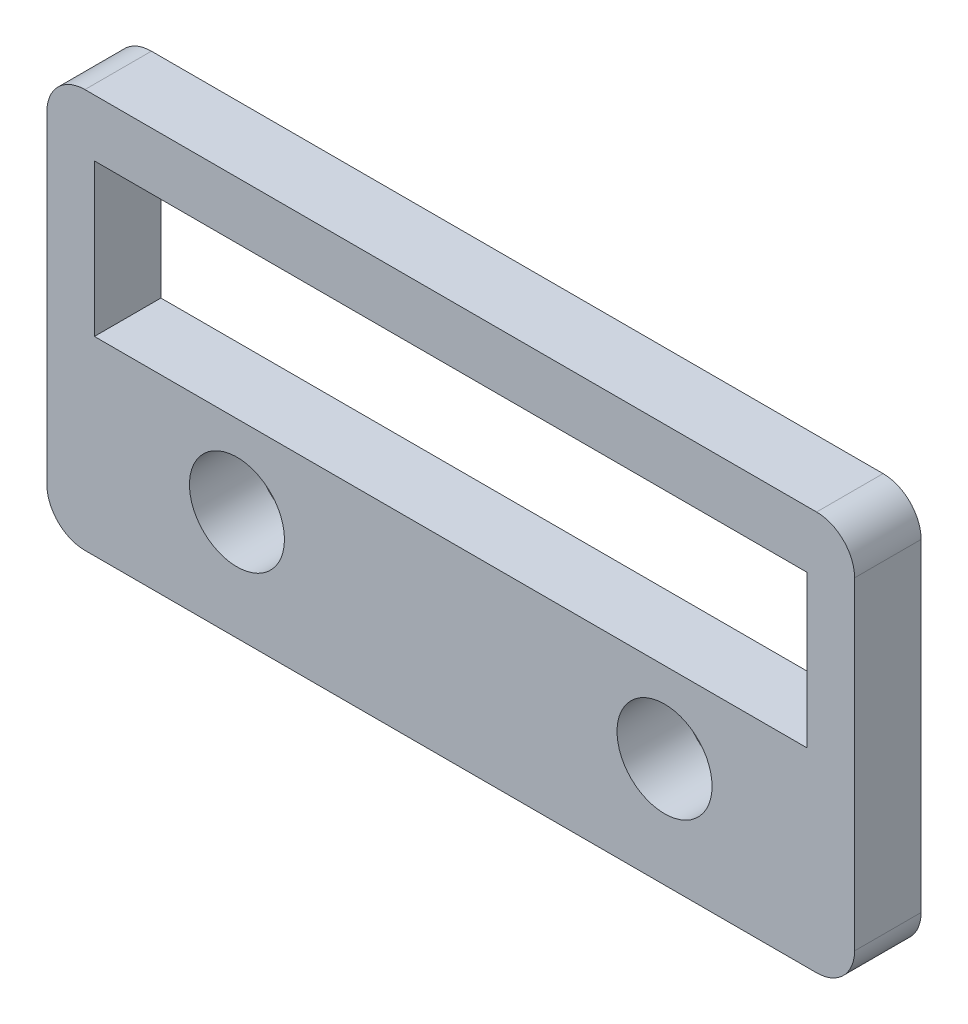
ISO-10303-21;
HEADER;
FILE_DESCRIPTION(('STEP AP214'),'2;1');
FILE_NAME('part.step','',(''),(''),'','','');
FILE_SCHEMA(('AUTOMOTIVE_DESIGN { 1 0 10303 214 1 1 1 1 }'));
ENDSEC;
DATA;
#1=APPLICATION_CONTEXT('core data for automotive mechanical design processes');
#2=APPLICATION_PROTOCOL_DEFINITION('international standard','automotive_design',2000,#1);
#3=PRODUCT_CONTEXT('',#1,'mechanical');
#4=PRODUCT('Part','Part','',(#3));
#5=PRODUCT_RELATED_PRODUCT_CATEGORY('part','',(#4));
#6=PRODUCT_DEFINITION_FORMATION('','',#4);
#7=PRODUCT_DEFINITION_CONTEXT('part definition',#1,'design');
#8=PRODUCT_DEFINITION('design','',#6,#7);
#9=PRODUCT_DEFINITION_SHAPE('','',#8);
#10=(LENGTH_UNIT() NAMED_UNIT(*) SI_UNIT(.MILLI.,.METRE.));
#11=(NAMED_UNIT(*) PLANE_ANGLE_UNIT() SI_UNIT($,.RADIAN.));
#12=(NAMED_UNIT(*) SI_UNIT($,.STERADIAN.) SOLID_ANGLE_UNIT());
#13=UNCERTAINTY_MEASURE_WITH_UNIT(LENGTH_MEASURE(1.E-05),#10,'distance_accuracy_value','');
#14=(GEOMETRIC_REPRESENTATION_CONTEXT(3) GLOBAL_UNCERTAINTY_ASSIGNED_CONTEXT((#13)) GLOBAL_UNIT_ASSIGNED_CONTEXT((#10,
#11,#12)) REPRESENTATION_CONTEXT('',''));
#15=CARTESIAN_POINT('',(0.,0.,0.));
#16=DIRECTION('',(0.,0.,1.));
#17=DIRECTION('',(1.,0.,0.));
#18=AXIS2_PLACEMENT_3D('',#15,#16,#17);
#19=CARTESIAN_POINT('',(47.6959064327485,23.5877192982456,7.));
#20=DIRECTION('',(0.,0.,-1.));
#21=DIRECTION('',(-1.,0.,0.));
#22=AXIS2_PLACEMENT_3D('',#19,#20,#21);
#23=CYLINDRICAL_SURFACE('',#22,4.);
#24=CARTESIAN_POINT('',(47.6959064327485,23.5877192982456,0.));
#25=DIRECTION('',(0.,0.,1.));
#26=DIRECTION('',(-1.,0.,0.));
#27=AXIS2_PLACEMENT_3D('',#24,#25,#26);
#28=CIRCLE('',#27,4.);
#29=CARTESIAN_POINT('',(51.6959064327485,23.5877192982456,0.));
#30=VERTEX_POINT('',#29);
#31=CARTESIAN_POINT('',(47.6959064327485,27.5877192982456,0.));
#32=VERTEX_POINT('',#31);
#33=EDGE_CURVE('E175',#30,#32,#28,.T.);
#34=ORIENTED_EDGE('',*,*,#33,.T.);
#35=DIRECTION('',(0.,0.,-1.));
#36=VECTOR('',#35,1.);
#37=CARTESIAN_POINT('',(47.6959064327485,27.5877192982456,7.));
#38=LINE('',#37,#36);
#39=CARTESIAN_POINT('',(47.6959064327485,27.5877192982456,7.));
#40=VERTEX_POINT('',#39);
#41=EDGE_CURVE('E11',#40,#32,#38,.T.);
#42=ORIENTED_EDGE('',*,*,#41,.F.);
#43=CARTESIAN_POINT('',(47.6959064327485,23.5877192982456,7.));
#44=DIRECTION('',(0.,0.,1.));
#45=DIRECTION('',(-1.,0.,0.));
#46=AXIS2_PLACEMENT_3D('',#43,#44,#45);
#47=CIRCLE('',#46,4.);
#48=CARTESIAN_POINT('',(51.6959064327485,23.5877192982456,7.));
#49=VERTEX_POINT('',#48);
#50=EDGE_CURVE('E181',#49,#40,#47,.T.);
#51=ORIENTED_EDGE('',*,*,#50,.F.);
#52=DIRECTION('',(0.,0.,-1.));
#53=VECTOR('',#52,1.);
#54=CARTESIAN_POINT('',(51.6959064327485,23.5877192982456,7.));
#55=LINE('',#54,#53);
#56=EDGE_CURVE('E207',#49,#30,#55,.T.);
#57=ORIENTED_EDGE('',*,*,#56,.T.);
#58=EDGE_LOOP('',(#34,#42,#51,#57));
#59=FACE_BOUND('',#58,.T.);
#60=ADVANCED_FACE('F39',(#59),#23,.T.);
#61=CARTESIAN_POINT('',(-29.3040935672514,27.5877192982456,7.));
#62=DIRECTION('',(0.,-1.,0.));
#63=DIRECTION('',(0.,0.,-1.));
#64=AXIS2_PLACEMENT_3D('',#61,#62,#63);
#65=PLANE('',#64);
#66=DIRECTION('',(-1.,0.,0.));
#67=VECTOR('',#66,1.);
#68=CARTESIAN_POINT('',(-29.3040935672514,27.5877192982456,0.));
#69=LINE('',#68,#67);
#70=CARTESIAN_POINT('',(-29.3040935672514,27.5877192982456,0.));
#71=VERTEX_POINT('',#70);
#72=EDGE_CURVE('E211',#32,#71,#69,.T.);
#73=ORIENTED_EDGE('',*,*,#72,.T.);
#74=DIRECTION('',(0.,0.,-1.));
#75=VECTOR('',#74,1.);
#76=CARTESIAN_POINT('',(-29.3040935672514,27.5877192982456,7.));
#77=LINE('',#76,#75);
#78=CARTESIAN_POINT('',(-29.3040935672514,27.5877192982456,7.));
#79=VERTEX_POINT('',#78);
#80=EDGE_CURVE('E47',#79,#71,#77,.T.);
#81=ORIENTED_EDGE('',*,*,#80,.F.);
#82=DIRECTION('',(-1.,0.,0.));
#83=VECTOR('',#82,1.);
#84=CARTESIAN_POINT('',(-29.3040935672514,27.5877192982456,7.));
#85=LINE('',#84,#83);
#86=EDGE_CURVE('E185',#40,#79,#85,.T.);
#87=ORIENTED_EDGE('',*,*,#86,.F.);
#88=ORIENTED_EDGE('',*,*,#41,.T.);
#89=EDGE_LOOP('',(#73,#81,#87,#88));
#90=FACE_BOUND('',#89,.T.);
#91=ADVANCED_FACE('F280',(#90),#65,.F.);
#92=CARTESIAN_POINT('',(-29.3040935672515,23.5877192982456,7.));
#93=DIRECTION('',(0.,0.,-1.));
#94=DIRECTION('',(-1.,0.,0.));
#95=AXIS2_PLACEMENT_3D('',#92,#93,#94);
#96=CYLINDRICAL_SURFACE('',#95,4.);
#97=CARTESIAN_POINT('',(-29.3040935672515,23.5877192982456,0.));
#98=DIRECTION('',(0.,0.,1.));
#99=DIRECTION('',(-1.,0.,0.));
#100=AXIS2_PLACEMENT_3D('',#97,#98,#99);
#101=CIRCLE('',#100,4.);
#102=CARTESIAN_POINT('',(-33.3040935672515,23.5877192982456,0.));
#103=VERTEX_POINT('',#102);
#104=EDGE_CURVE('E214',#71,#103,#101,.T.);
#105=ORIENTED_EDGE('',*,*,#104,.T.);
#106=DIRECTION('',(0.,0.,-1.));
#107=VECTOR('',#106,1.);
#108=CARTESIAN_POINT('',(-33.3040935672515,23.5877192982456,7.));
#109=LINE('',#108,#107);
#110=CARTESIAN_POINT('',(-33.3040935672515,23.5877192982456,7.));
#111=VERTEX_POINT('',#110);
#112=EDGE_CURVE('E250',#111,#103,#109,.T.);
#113=ORIENTED_EDGE('',*,*,#112,.F.);
#114=CARTESIAN_POINT('',(-29.3040935672515,23.5877192982456,7.));
#115=DIRECTION('',(0.,0.,1.));
#116=DIRECTION('',(-1.,0.,0.));
#117=AXIS2_PLACEMENT_3D('',#114,#115,#116);
#118=CIRCLE('',#117,4.);
#119=EDGE_CURVE('E189',#79,#111,#118,.T.);
#120=ORIENTED_EDGE('',*,*,#119,.F.);
#121=ORIENTED_EDGE('',*,*,#80,.T.);
#122=EDGE_LOOP('',(#105,#113,#120,#121));
#123=FACE_BOUND('',#122,.T.);
#124=ADVANCED_FACE('F259',(#123),#96,.T.);
#125=CARTESIAN_POINT('',(-33.3040935672515,23.5877192982456,7.));
#126=DIRECTION('',(1.,0.,0.));
#127=DIRECTION('',(0.,1.,0.));
#128=AXIS2_PLACEMENT_3D('',#125,#126,#127);
#129=PLANE('',#128);
#130=DIRECTION('',(0.,-1.,0.));
#131=VECTOR('',#130,1.);
#132=CARTESIAN_POINT('',(-33.3040935672515,23.5877192982456,0.));
#133=LINE('',#132,#131);
#134=CARTESIAN_POINT('',(-33.3040935672515,-10.4122807017544,0.));
#135=VERTEX_POINT('',#134);
#136=EDGE_CURVE('E217',#103,#135,#133,.T.);
#137=ORIENTED_EDGE('',*,*,#136,.T.);
#138=DIRECTION('',(0.,0.,-1.));
#139=VECTOR('',#138,1.);
#140=CARTESIAN_POINT('',(-33.3040935672515,-10.4122807017544,7.));
#141=LINE('',#140,#139);
#142=CARTESIAN_POINT('',(-33.3040935672515,-10.4122807017544,7.));
#143=VERTEX_POINT('',#142);
#144=EDGE_CURVE('E246',#143,#135,#141,.T.);
#145=ORIENTED_EDGE('',*,*,#144,.F.);
#146=DIRECTION('',(0.,-1.,0.));
#147=VECTOR('',#146,1.);
#148=CARTESIAN_POINT('',(-33.3040935672515,23.5877192982456,7.));
#149=LINE('',#148,#147);
#150=EDGE_CURVE('E192',#111,#143,#149,.T.);
#151=ORIENTED_EDGE('',*,*,#150,.F.);
#152=ORIENTED_EDGE('',*,*,#112,.T.);
#153=EDGE_LOOP('',(#137,#145,#151,#152));
#154=FACE_BOUND('',#153,.T.);
#155=ADVANCED_FACE('F268',(#154),#129,.F.);
#156=CARTESIAN_POINT('',(-29.3040935672515,-10.4122807017544,7.));
#157=DIRECTION('',(0.,0.,-1.));
#158=DIRECTION('',(-1.,0.,0.));
#159=AXIS2_PLACEMENT_3D('',#156,#157,#158);
#160=CYLINDRICAL_SURFACE('',#159,4.);
#161=CARTESIAN_POINT('',(-29.3040935672515,-10.4122807017544,0.));
#162=DIRECTION('',(0.,0.,1.));
#163=DIRECTION('',(1.,0.,0.));
#164=AXIS2_PLACEMENT_3D('',#161,#162,#163);
#165=CIRCLE('',#164,4.);
#166=CARTESIAN_POINT('',(-29.3040935672514,-14.4122807017544,0.));
#167=VERTEX_POINT('',#166);
#168=EDGE_CURVE('E220',#135,#167,#165,.T.);
#169=ORIENTED_EDGE('',*,*,#168,.T.);
#170=DIRECTION('',(0.,0.,-1.));
#171=VECTOR('',#170,1.);
#172=CARTESIAN_POINT('',(-29.3040935672514,-14.4122807017544,7.));
#173=LINE('',#172,#171);
#174=CARTESIAN_POINT('',(-29.3040935672514,-14.4122807017544,7.));
#175=VERTEX_POINT('',#174);
#176=EDGE_CURVE('E242',#175,#167,#173,.T.);
#177=ORIENTED_EDGE('',*,*,#176,.F.);
#178=CARTESIAN_POINT('',(-29.3040935672515,-10.4122807017544,7.));
#179=DIRECTION('',(0.,0.,1.));
#180=DIRECTION('',(1.,0.,0.));
#181=AXIS2_PLACEMENT_3D('',#178,#179,#180);
#182=CIRCLE('',#181,4.);
#183=EDGE_CURVE('E195',#143,#175,#182,.T.);
#184=ORIENTED_EDGE('',*,*,#183,.F.);
#185=ORIENTED_EDGE('',*,*,#144,.T.);
#186=EDGE_LOOP('',(#169,#177,#184,#185));
#187=FACE_BOUND('',#186,.T.);
#188=ADVANCED_FACE('F272',(#187),#160,.T.);
#189=CARTESIAN_POINT('',(-29.3040935672514,-14.4122807017544,7.));
#190=DIRECTION('',(0.,1.,0.));
#191=DIRECTION('',(0.,0.,1.));
#192=AXIS2_PLACEMENT_3D('',#189,#190,#191);
#193=PLANE('',#192);
#194=DIRECTION('',(1.,0.,0.));
#195=VECTOR('',#194,1.);
#196=CARTESIAN_POINT('',(-29.3040935672514,-14.4122807017544,0.));
#197=LINE('',#196,#195);
#198=CARTESIAN_POINT('',(47.6959064327485,-14.4122807017544,0.));
#199=VERTEX_POINT('',#198);
#200=EDGE_CURVE('E223',#167,#199,#197,.T.);
#201=ORIENTED_EDGE('',*,*,#200,.T.);
#202=DIRECTION('',(0.,0.,-1.));
#203=VECTOR('',#202,1.);
#204=CARTESIAN_POINT('',(47.6959064327485,-14.4122807017544,7.));
#205=LINE('',#204,#203);
#206=CARTESIAN_POINT('',(47.6959064327485,-14.4122807017544,7.));
#207=VERTEX_POINT('',#206);
#208=EDGE_CURVE('E238',#207,#199,#205,.T.);
#209=ORIENTED_EDGE('',*,*,#208,.F.);
#210=DIRECTION('',(1.,0.,0.));
#211=VECTOR('',#210,1.);
#212=CARTESIAN_POINT('',(-29.3040935672514,-14.4122807017544,7.));
#213=LINE('',#212,#211);
#214=EDGE_CURVE('E198',#175,#207,#213,.T.);
#215=ORIENTED_EDGE('',*,*,#214,.F.);
#216=ORIENTED_EDGE('',*,*,#176,.T.);
#217=EDGE_LOOP('',(#201,#209,#215,#216));
#218=FACE_BOUND('',#217,.T.);
#219=ADVANCED_FACE('F293',(#218),#193,.F.);
#220=CARTESIAN_POINT('',(47.6959064327485,-10.4122807017544,7.));
#221=DIRECTION('',(0.,0.,-1.));
#222=DIRECTION('',(-1.,0.,0.));
#223=AXIS2_PLACEMENT_3D('',#220,#221,#222);
#224=CYLINDRICAL_SURFACE('',#223,4.);
#225=CARTESIAN_POINT('',(47.6959064327485,-10.4122807017544,0.));
#226=DIRECTION('',(0.,0.,1.));
#227=DIRECTION('',(-1.,0.,0.));
#228=AXIS2_PLACEMENT_3D('',#225,#226,#227);
#229=CIRCLE('',#228,4.);
#230=CARTESIAN_POINT('',(51.6959064327485,-10.4122807017544,0.));
#231=VERTEX_POINT('',#230);
#232=EDGE_CURVE('E226',#199,#231,#229,.T.);
#233=ORIENTED_EDGE('',*,*,#232,.T.);
#234=DIRECTION('',(0.,0.,-1.));
#235=VECTOR('',#234,1.);
#236=CARTESIAN_POINT('',(51.6959064327485,-10.4122807017544,7.));
#237=LINE('',#236,#235);
#238=CARTESIAN_POINT('',(51.6959064327485,-10.4122807017544,7.));
#239=VERTEX_POINT('',#238);
#240=EDGE_CURVE('E234',#239,#231,#237,.T.);
#241=ORIENTED_EDGE('',*,*,#240,.F.);
#242=CARTESIAN_POINT('',(47.6959064327485,-10.4122807017544,7.));
#243=DIRECTION('',(0.,0.,1.));
#244=DIRECTION('',(-1.,0.,0.));
#245=AXIS2_PLACEMENT_3D('',#242,#243,#244);
#246=CIRCLE('',#245,4.);
#247=EDGE_CURVE('E201',#207,#239,#246,.T.);
#248=ORIENTED_EDGE('',*,*,#247,.F.);
#249=ORIENTED_EDGE('',*,*,#208,.T.);
#250=EDGE_LOOP('',(#233,#241,#248,#249));
#251=FACE_BOUND('',#250,.T.);
#252=ADVANCED_FACE('F291',(#251),#224,.T.);
#253=CARTESIAN_POINT('',(51.6959064327485,23.5877192982456,7.));
#254=DIRECTION('',(-1.,0.,0.));
#255=DIRECTION('',(0.,-1.,0.));
#256=AXIS2_PLACEMENT_3D('',#253,#254,#255);
#257=PLANE('',#256);
#258=DIRECTION('',(0.,1.,0.));
#259=VECTOR('',#258,1.);
#260=CARTESIAN_POINT('',(51.6959064327485,23.5877192982456,0.));
#261=LINE('',#260,#259);
#262=EDGE_CURVE('E186',#231,#30,#261,.T.);
#263=ORIENTED_EDGE('',*,*,#262,.T.);
#264=ORIENTED_EDGE('',*,*,#56,.F.);
#265=DIRECTION('',(0.,1.,0.));
#266=VECTOR('',#265,1.);
#267=CARTESIAN_POINT('',(51.6959064327485,23.5877192982456,7.));
#268=LINE('',#267,#266);
#269=EDGE_CURVE('E204',#239,#49,#268,.T.);
#270=ORIENTED_EDGE('',*,*,#269,.F.);
#271=ORIENTED_EDGE('',*,*,#240,.T.);
#272=EDGE_LOOP('',(#263,#264,#270,#271));
#273=FACE_BOUND('',#272,.T.);
#274=ADVANCED_FACE('F286',(#273),#257,.F.);
#275=CARTESIAN_POINT('',(47.6959064327485,23.5877192982456,7.));
#276=DIRECTION('',(0.,0.,-1.));
#277=DIRECTION('',(-1.,0.,0.));
#278=AXIS2_PLACEMENT_3D('',#275,#276,#277);
#279=PLANE('',#278);
#280=CARTESIAN_POINT('',(31.6959064327485,-2.91228070175439,7.));
#281=DIRECTION('',(0.,0.,1.));
#282=DIRECTION('',(1.,0.,0.));
#283=AXIS2_PLACEMENT_3D('',#280,#281,#282);
#284=CIRCLE('',#283,5.);
#285=CARTESIAN_POINT('',(36.6959064327485,-2.91228070175439,7.));
#286=VERTEX_POINT('',#285);
#287=EDGE_CURVE('E420',#286,#286,#284,.T.);
#288=ORIENTED_EDGE('',*,*,#287,.F.);
#289=EDGE_LOOP('',(#288));
#290=FACE_BOUND('',#289,.T.);
#291=CARTESIAN_POINT('',(-13.3040935672515,-2.91228070175439,7.));
#292=DIRECTION('',(0.,0.,1.));
#293=DIRECTION('',(1.,0.,0.));
#294=AXIS2_PLACEMENT_3D('',#291,#292,#293);
#295=CIRCLE('',#294,5.);
#296=CARTESIAN_POINT('',(-8.30409356725148,-2.91228070175439,7.));
#297=VERTEX_POINT('',#296);
#298=EDGE_CURVE('E156',#297,#297,#295,.T.);
#299=ORIENTED_EDGE('',*,*,#298,.F.);
#300=EDGE_LOOP('',(#299));
#301=FACE_BOUND('',#300,.T.);
#302=DIRECTION('',(1.,0.,0.));
#303=VECTOR('',#302,1.);
#304=CARTESIAN_POINT('',(-28.3040935672515,5.58771929824561,7.));
#305=LINE('',#304,#303);
#306=CARTESIAN_POINT('',(-28.3040935672515,5.58771929824561,7.));
#307=VERTEX_POINT('',#306);
#308=CARTESIAN_POINT('',(46.6959064327485,5.58771929824561,7.));
#309=VERTEX_POINT('',#308);
#310=EDGE_CURVE('E165',#307,#309,#305,.T.);
#311=ORIENTED_EDGE('',*,*,#310,.F.);
#312=DIRECTION('',(0.,-1.,0.));
#313=VECTOR('',#312,1.);
#314=CARTESIAN_POINT('',(-28.3040935672515,21.5877192982456,7.));
#315=LINE('',#314,#313);
#316=CARTESIAN_POINT('',(-28.3040935672515,21.5877192982456,7.));
#317=VERTEX_POINT('',#316);
#318=EDGE_CURVE('E54',#317,#307,#315,.T.);
#319=ORIENTED_EDGE('',*,*,#318,.F.);
#320=DIRECTION('',(-1.,0.,0.));
#321=VECTOR('',#320,1.);
#322=CARTESIAN_POINT('',(-28.3040935672515,21.5877192982456,7.));
#323=LINE('',#322,#321);
#324=CARTESIAN_POINT('',(46.6959064327485,21.5877192982456,7.));
#325=VERTEX_POINT('',#324);
#326=EDGE_CURVE('E149',#325,#317,#323,.T.);
#327=ORIENTED_EDGE('',*,*,#326,.F.);
#328=DIRECTION('',(0.,1.,0.));
#329=VECTOR('',#328,1.);
#330=CARTESIAN_POINT('',(46.6959064327485,21.5877192982456,7.));
#331=LINE('',#330,#329);
#332=EDGE_CURVE('E153',#309,#325,#331,.T.);
#333=ORIENTED_EDGE('',*,*,#332,.F.);
#334=EDGE_LOOP('',(#311,#319,#327,#333));
#335=FACE_BOUND('',#334,.T.);
#336=ORIENTED_EDGE('',*,*,#50,.T.);
#337=ORIENTED_EDGE('',*,*,#86,.T.);
#338=ORIENTED_EDGE('',*,*,#119,.T.);
#339=ORIENTED_EDGE('',*,*,#150,.T.);
#340=ORIENTED_EDGE('',*,*,#183,.T.);
#341=ORIENTED_EDGE('',*,*,#214,.T.);
#342=ORIENTED_EDGE('',*,*,#247,.T.);
#343=ORIENTED_EDGE('',*,*,#269,.T.);
#344=EDGE_LOOP('',(#336,#337,#338,#339,#340,#341,#342,#343));
#345=FACE_BOUND('',#344,.T.);
#346=ADVANCED_FACE('F276',(#290,#301,#335,#345),#279,.F.);
#347=CARTESIAN_POINT('',(47.6959064327485,23.5877192982456,0.));
#348=DIRECTION('',(0.,0.,-1.));
#349=DIRECTION('',(-1.,0.,0.));
#350=AXIS2_PLACEMENT_3D('',#347,#348,#349);
#351=PLANE('',#350);
#352=CARTESIAN_POINT('',(31.6959064327485,-2.91228070175439,0.));
#353=DIRECTION('',(0.,0.,1.));
#354=DIRECTION('',(1.,0.,0.));
#355=AXIS2_PLACEMENT_3D('',#352,#353,#354);
#356=CIRCLE('',#355,5.);
#357=CARTESIAN_POINT('',(36.6959064327485,-2.91228070175439,0.));
#358=VERTEX_POINT('',#357);
#359=EDGE_CURVE('E166',#358,#358,#356,.T.);
#360=ORIENTED_EDGE('',*,*,#359,.T.);
#361=EDGE_LOOP('',(#360));
#362=FACE_BOUND('',#361,.T.);
#363=CARTESIAN_POINT('',(-13.3040935672515,-2.91228070175439,0.));
#364=DIRECTION('',(0.,0.,1.));
#365=DIRECTION('',(1.,0.,0.));
#366=AXIS2_PLACEMENT_3D('',#363,#364,#365);
#367=CIRCLE('',#366,5.);
#368=CARTESIAN_POINT('',(-8.30409356725148,-2.91228070175439,0.));
#369=VERTEX_POINT('',#368);
#370=EDGE_CURVE('E422',#369,#369,#367,.T.);
#371=ORIENTED_EDGE('',*,*,#370,.T.);
#372=EDGE_LOOP('',(#371));
#373=FACE_BOUND('',#372,.T.);
#374=DIRECTION('',(0.,-1.,0.));
#375=VECTOR('',#374,1.);
#376=CARTESIAN_POINT('',(-28.3040935672515,21.5877192982456,0.));
#377=LINE('',#376,#375);
#378=CARTESIAN_POINT('',(-28.3040935672515,21.5877192982456,0.));
#379=VERTEX_POINT('',#378);
#380=CARTESIAN_POINT('',(-28.3040935672515,5.58771929824561,0.));
#381=VERTEX_POINT('',#380);
#382=EDGE_CURVE('E130',#379,#381,#377,.T.);
#383=ORIENTED_EDGE('',*,*,#382,.T.);
#384=DIRECTION('',(1.,0.,0.));
#385=VECTOR('',#384,1.);
#386=CARTESIAN_POINT('',(-28.3040935672515,5.58771929824561,0.));
#387=LINE('',#386,#385);
#388=CARTESIAN_POINT('',(46.6959064327485,5.58771929824561,0.));
#389=VERTEX_POINT('',#388);
#390=EDGE_CURVE('E140',#381,#389,#387,.T.);
#391=ORIENTED_EDGE('',*,*,#390,.T.);
#392=DIRECTION('',(0.,1.,0.));
#393=VECTOR('',#392,1.);
#394=CARTESIAN_POINT('',(46.6959064327485,21.5877192982456,0.));
#395=LINE('',#394,#393);
#396=CARTESIAN_POINT('',(46.6959064327485,21.5877192982456,0.));
#397=VERTEX_POINT('',#396);
#398=EDGE_CURVE('E62',#389,#397,#395,.T.);
#399=ORIENTED_EDGE('',*,*,#398,.T.);
#400=DIRECTION('',(-1.,0.,0.));
#401=VECTOR('',#400,1.);
#402=CARTESIAN_POINT('',(-28.3040935672515,21.5877192982456,0.));
#403=LINE('',#402,#401);
#404=EDGE_CURVE('E137',#397,#379,#403,.T.);
#405=ORIENTED_EDGE('',*,*,#404,.T.);
#406=EDGE_LOOP('',(#383,#391,#399,#405));
#407=FACE_BOUND('',#406,.T.);
#408=ORIENTED_EDGE('',*,*,#33,.F.);
#409=ORIENTED_EDGE('',*,*,#262,.F.);
#410=ORIENTED_EDGE('',*,*,#232,.F.);
#411=ORIENTED_EDGE('',*,*,#200,.F.);
#412=ORIENTED_EDGE('',*,*,#168,.F.);
#413=ORIENTED_EDGE('',*,*,#136,.F.);
#414=ORIENTED_EDGE('',*,*,#104,.F.);
#415=ORIENTED_EDGE('',*,*,#72,.F.);
#416=EDGE_LOOP('',(#408,#409,#410,#411,#412,#413,#414,#415));
#417=FACE_BOUND('',#416,.T.);
#418=ADVANCED_FACE('F145',(#362,#373,#407,#417),#351,.T.);
#419=CARTESIAN_POINT('',(-28.3040935672515,21.5877192982456,0.));
#420=DIRECTION('',(-1.,0.,0.));
#421=DIRECTION('',(0.,-1.,0.));
#422=AXIS2_PLACEMENT_3D('',#419,#420,#421);
#423=PLANE('',#422);
#424=ORIENTED_EDGE('',*,*,#318,.T.);
#425=DIRECTION('',(0.,0.,1.));
#426=VECTOR('',#425,1.);
#427=CARTESIAN_POINT('',(-28.3040935672515,5.58771929824561,0.));
#428=LINE('',#427,#426);
#429=EDGE_CURVE('E126',#381,#307,#428,.T.);
#430=ORIENTED_EDGE('',*,*,#429,.F.);
#431=ORIENTED_EDGE('',*,*,#382,.F.);
#432=DIRECTION('',(0.,0.,1.));
#433=VECTOR('',#432,1.);
#434=CARTESIAN_POINT('',(-28.3040935672515,21.5877192982456,0.));
#435=LINE('',#434,#433);
#436=EDGE_CURVE('E172',#379,#317,#435,.T.);
#437=ORIENTED_EDGE('',*,*,#436,.T.);
#438=EDGE_LOOP('',(#424,#430,#431,#437));
#439=FACE_BOUND('',#438,.T.);
#440=ADVANCED_FACE('F128',(#439),#423,.F.);
#441=CARTESIAN_POINT('',(-28.3040935672515,21.5877192982456,0.));
#442=DIRECTION('',(0.,1.,0.));
#443=DIRECTION('',(0.,0.,1.));
#444=AXIS2_PLACEMENT_3D('',#441,#442,#443);
#445=PLANE('',#444);
#446=ORIENTED_EDGE('',*,*,#326,.T.);
#447=ORIENTED_EDGE('',*,*,#436,.F.);
#448=ORIENTED_EDGE('',*,*,#404,.F.);
#449=DIRECTION('',(0.,0.,1.));
#450=VECTOR('',#449,1.);
#451=CARTESIAN_POINT('',(46.6959064327485,21.5877192982456,0.));
#452=LINE('',#451,#450);
#453=EDGE_CURVE('E176',#397,#325,#452,.T.);
#454=ORIENTED_EDGE('',*,*,#453,.T.);
#455=EDGE_LOOP('',(#446,#447,#448,#454));
#456=FACE_BOUND('',#455,.T.);
#457=ADVANCED_FACE('F349',(#456),#445,.F.);
#458=CARTESIAN_POINT('',(46.6959064327485,21.5877192982456,0.));
#459=DIRECTION('',(1.,0.,0.));
#460=DIRECTION('',(0.,0.,-1.));
#461=AXIS2_PLACEMENT_3D('',#458,#459,#460);
#462=PLANE('',#461);
#463=ORIENTED_EDGE('',*,*,#332,.T.);
#464=ORIENTED_EDGE('',*,*,#453,.F.);
#465=ORIENTED_EDGE('',*,*,#398,.F.);
#466=DIRECTION('',(0.,0.,1.));
#467=VECTOR('',#466,1.);
#468=CARTESIAN_POINT('',(46.6959064327485,5.58771929824561,0.));
#469=LINE('',#468,#467);
#470=EDGE_CURVE('E136',#389,#309,#469,.T.);
#471=ORIENTED_EDGE('',*,*,#470,.T.);
#472=EDGE_LOOP('',(#463,#464,#465,#471));
#473=FACE_BOUND('',#472,.T.);
#474=ADVANCED_FACE('F360',(#473),#462,.F.);
#475=CARTESIAN_POINT('',(-28.3040935672515,5.58771929824561,0.));
#476=DIRECTION('',(0.,-1.,0.));
#477=DIRECTION('',(0.,0.,-1.));
#478=AXIS2_PLACEMENT_3D('',#475,#476,#477);
#479=PLANE('',#478);
#480=ORIENTED_EDGE('',*,*,#310,.T.);
#481=ORIENTED_EDGE('',*,*,#470,.F.);
#482=ORIENTED_EDGE('',*,*,#390,.F.);
#483=ORIENTED_EDGE('',*,*,#429,.T.);
#484=EDGE_LOOP('',(#480,#481,#482,#483));
#485=FACE_BOUND('',#484,.T.);
#486=ADVANCED_FACE('F141',(#485),#479,.F.);
#487=CARTESIAN_POINT('',(-13.3040935672515,-2.91228070175439,0.));
#488=DIRECTION('',(0.,0.,1.));
#489=DIRECTION('',(1.,0.,0.));
#490=AXIS2_PLACEMENT_3D('',#487,#488,#489);
#491=CYLINDRICAL_SURFACE('',#490,5.);
#492=ORIENTED_EDGE('',*,*,#370,.F.);
#493=EDGE_LOOP('',(#492));
#494=FACE_BOUND('',#493,.T.);
#495=ORIENTED_EDGE('',*,*,#298,.T.);
#496=EDGE_LOOP('',(#495));
#497=FACE_BOUND('',#496,.T.);
#498=ADVANCED_FACE('F378',(#494,#497),#491,.F.);
#499=CARTESIAN_POINT('',(31.6959064327485,-2.91228070175439,0.));
#500=DIRECTION('',(0.,0.,1.));
#501=DIRECTION('',(1.,0.,0.));
#502=AXIS2_PLACEMENT_3D('',#499,#500,#501);
#503=CYLINDRICAL_SURFACE('',#502,5.);
#504=ORIENTED_EDGE('',*,*,#359,.F.);
#505=EDGE_LOOP('',(#504));
#506=FACE_BOUND('',#505,.T.);
#507=ORIENTED_EDGE('',*,*,#287,.T.);
#508=EDGE_LOOP('',(#507));
#509=FACE_BOUND('',#508,.T.);
#510=ADVANCED_FACE('F401',(#506,#509),#503,.F.);
#511=CLOSED_SHELL('',(#60,#91,#124,#155,#188,#219,#252,#274,#346,#418,#440,#457,#474,#486,#498,#510));
#512=MANIFOLD_SOLID_BREP('B2',#511);
#513=ADVANCED_BREP_SHAPE_REPRESENTATION('',(#18,#512),#14);
#514=SHAPE_DEFINITION_REPRESENTATION(#9,#513);
ENDSEC;
END-ISO-10303-21;
